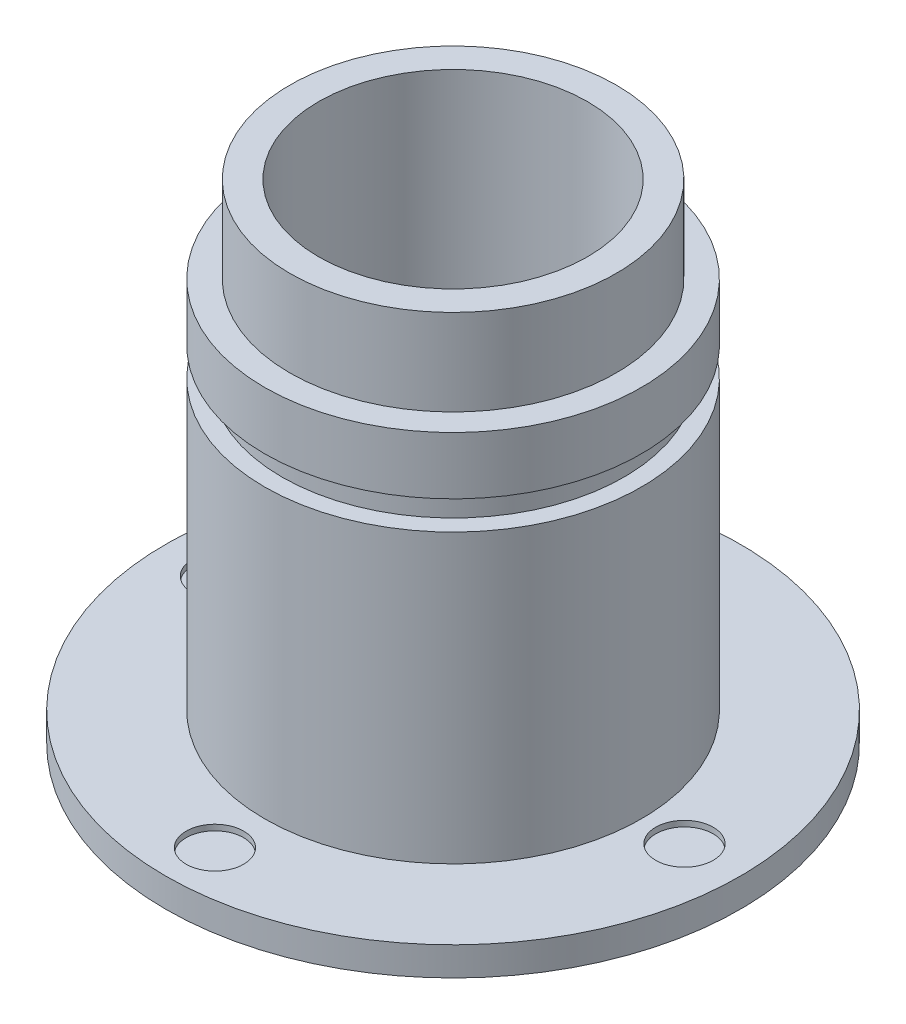
ISO-10303-21;
HEADER;
FILE_DESCRIPTION(('STEP AP214'),'2;1');
FILE_NAME('part.step','',(''),(''),'','','');
FILE_SCHEMA(('AUTOMOTIVE_DESIGN { 1 0 10303 214 1 1 1 1 }'));
ENDSEC;
DATA;
#1=APPLICATION_CONTEXT('core data for automotive mechanical design processes');
#2=APPLICATION_PROTOCOL_DEFINITION('international standard','automotive_design',2000,#1);
#3=PRODUCT_CONTEXT('',#1,'mechanical');
#4=PRODUCT('Part','Part','',(#3));
#5=PRODUCT_RELATED_PRODUCT_CATEGORY('part','',(#4));
#6=PRODUCT_DEFINITION_FORMATION('','',#4);
#7=PRODUCT_DEFINITION_CONTEXT('part definition',#1,'design');
#8=PRODUCT_DEFINITION('design','',#6,#7);
#9=PRODUCT_DEFINITION_SHAPE('','',#8);
#10=(LENGTH_UNIT() NAMED_UNIT(*) SI_UNIT(.MILLI.,.METRE.));
#11=(NAMED_UNIT(*) PLANE_ANGLE_UNIT() SI_UNIT($,.RADIAN.));
#12=(NAMED_UNIT(*) SI_UNIT($,.STERADIAN.) SOLID_ANGLE_UNIT());
#13=UNCERTAINTY_MEASURE_WITH_UNIT(LENGTH_MEASURE(1.E-05),#10,'distance_accuracy_value','');
#14=(GEOMETRIC_REPRESENTATION_CONTEXT(3) GLOBAL_UNCERTAINTY_ASSIGNED_CONTEXT((#13)) GLOBAL_UNIT_ASSIGNED_CONTEXT((#10,
#11,#12)) REPRESENTATION_CONTEXT('',''));
#15=CARTESIAN_POINT('',(0.,0.,0.));
#16=DIRECTION('',(0.,0.,1.));
#17=DIRECTION('',(1.,0.,0.));
#18=AXIS2_PLACEMENT_3D('',#15,#16,#17);
#19=CARTESIAN_POINT('',(0.,-77.6741071428572,0.));
#20=DIRECTION('',(0.,-1.,0.));
#21=DIRECTION('',(0.,0.,-1.));
#22=AXIS2_PLACEMENT_3D('',#19,#20,#21);
#23=PLANE('',#22);
#24=CARTESIAN_POINT('',(0.,-77.6741071428572,0.));
#25=DIRECTION('',(0.,1.,0.));
#26=DIRECTION('',(0.,0.,1.));
#27=AXIS2_PLACEMENT_3D('',#24,#25,#26);
#28=CIRCLE('',#27,127.);
#29=CARTESIAN_POINT('',(0.,-77.6741071428572,127.));
#30=VERTEX_POINT('',#29);
#31=EDGE_CURVE('E12',#30,#30,#28,.T.);
#32=ORIENTED_EDGE('',*,*,#31,.F.);
#33=EDGE_LOOP('',(#32));
#34=FACE_BOUND('',#33,.T.);
#35=ADVANCED_FACE('F34',(#34),#23,.T.);
#36=CARTESIAN_POINT('',(0.,71.3241071428572,0.));
#37=DIRECTION('',(0.,1.,0.));
#38=DIRECTION('',(0.,0.,1.));
#39=AXIS2_PLACEMENT_3D('',#36,#37,#38);
#40=CYLINDRICAL_SURFACE('',#39,127.);
#41=ORIENTED_EDGE('',*,*,#31,.T.);
#42=EDGE_LOOP('',(#41));
#43=FACE_BOUND('',#42,.T.);
#44=CARTESIAN_POINT('',(0.,-64.9741071428572,0.));
#45=DIRECTION('',(0.,1.,0.));
#46=DIRECTION('',(0.,0.,1.));
#47=AXIS2_PLACEMENT_3D('',#44,#45,#46);
#48=CIRCLE('',#47,127.);
#49=CARTESIAN_POINT('',(0.,-64.9741071428572,127.));
#50=VERTEX_POINT('',#49);
#51=EDGE_CURVE('E41',#50,#50,#48,.T.);
#52=ORIENTED_EDGE('',*,*,#51,.F.);
#53=EDGE_LOOP('',(#52));
#54=FACE_BOUND('',#53,.T.);
#55=ADVANCED_FACE('F103',(#43,#54),#40,.T.);
#56=CARTESIAN_POINT('',(-127.,-64.9741071428572,0.));
#57=DIRECTION('',(0.,1.,0.));
#58=DIRECTION('',(0.,0.,1.));
#59=AXIS2_PLACEMENT_3D('',#56,#57,#58);
#60=PLANE('',#59);
#61=CARTESIAN_POINT('',(-102.608331847626,-64.9741071428572,0.));
#62=DIRECTION('',(0.,1.,0.));
#63=DIRECTION('',(0.,0.,1.));
#64=AXIS2_PLACEMENT_3D('',#61,#62,#63);
#65=CIRCLE('',#64,12.7);
#66=CARTESIAN_POINT('',(-102.608331847626,-64.9741071428572,12.7));
#67=VERTEX_POINT('',#66);
#68=EDGE_CURVE('E37',#67,#67,#65,.T.);
#69=ORIENTED_EDGE('',*,*,#68,.F.);
#70=EDGE_LOOP('',(#69));
#71=FACE_BOUND('',#70,.T.);
#72=CARTESIAN_POINT('',(0.,-64.9741071428572,105.234824983657));
#73=DIRECTION('',(0.,1.,0.));
#74=DIRECTION('',(0.,0.,1.));
#75=AXIS2_PLACEMENT_3D('',#72,#73,#74);
#76=CIRCLE('',#75,12.7);
#77=CARTESIAN_POINT('',(0.,-64.9741071428572,117.934824983657));
#78=VERTEX_POINT('',#77);
#79=EDGE_CURVE('E56',#78,#78,#76,.T.);
#80=ORIENTED_EDGE('',*,*,#79,.F.);
#81=EDGE_LOOP('',(#80));
#82=FACE_BOUND('',#81,.T.);
#83=CARTESIAN_POINT('',(102.258132762822,-64.9741071428572,0.));
#84=DIRECTION('',(0.,1.,0.));
#85=DIRECTION('',(0.,0.,1.));
#86=AXIS2_PLACEMENT_3D('',#83,#84,#85);
#87=CIRCLE('',#86,12.7);
#88=CARTESIAN_POINT('',(102.258132762822,-64.9741071428572,12.7));
#89=VERTEX_POINT('',#88);
#90=EDGE_CURVE('E53',#89,#89,#87,.T.);
#91=ORIENTED_EDGE('',*,*,#90,.F.);
#92=EDGE_LOOP('',(#91));
#93=FACE_BOUND('',#92,.T.);
#94=CARTESIAN_POINT('',(0.,-64.9741071428572,-99.2814405419859));
#95=DIRECTION('',(0.,1.,0.));
#96=DIRECTION('',(0.,0.,1.));
#97=AXIS2_PLACEMENT_3D('',#94,#95,#96);
#98=CIRCLE('',#97,12.7);
#99=CARTESIAN_POINT('',(0.,-64.9741071428572,-86.5814405419859));
#100=VERTEX_POINT('',#99);
#101=EDGE_CURVE('E50',#100,#100,#98,.T.);
#102=ORIENTED_EDGE('',*,*,#101,.F.);
#103=EDGE_LOOP('',(#102));
#104=FACE_BOUND('',#103,.T.);
#105=ORIENTED_EDGE('',*,*,#51,.T.);
#106=EDGE_LOOP('',(#105));
#107=FACE_BOUND('',#106,.T.);
#108=CARTESIAN_POINT('',(0.,-64.9741071428572,0.));
#109=DIRECTION('',(0.,1.,0.));
#110=DIRECTION('',(0.,0.,1.));
#111=AXIS2_PLACEMENT_3D('',#108,#109,#110);
#112=CIRCLE('',#111,83.2303571428571);
#113=CARTESIAN_POINT('',(0.,-64.9741071428572,83.2303571428571));
#114=VERTEX_POINT('',#113);
#115=EDGE_CURVE('E46',#114,#114,#112,.T.);
#116=ORIENTED_EDGE('',*,*,#115,.F.);
#117=EDGE_LOOP('',(#116));
#118=FACE_BOUND('',#117,.T.);
#119=ADVANCED_FACE('F101',(#71,#82,#93,#104,#107,#118),#60,.T.);
#120=CARTESIAN_POINT('',(0.,71.3241071428572,0.));
#121=DIRECTION('',(0.,1.,0.));
#122=DIRECTION('',(0.,0.,1.));
#123=AXIS2_PLACEMENT_3D('',#120,#121,#122);
#124=CYLINDRICAL_SURFACE('',#123,83.2303571428571);
#125=ORIENTED_EDGE('',*,*,#115,.T.);
#126=EDGE_LOOP('',(#125));
#127=FACE_BOUND('',#126,.T.);
#128=CARTESIAN_POINT('',(0.,62.0258928571428,0.));
#129=DIRECTION('',(0.,1.,0.));
#130=DIRECTION('',(0.,0.,1.));
#131=AXIS2_PLACEMENT_3D('',#128,#129,#130);
#132=CIRCLE('',#131,83.2303571428571);
#133=CARTESIAN_POINT('',(0.,62.0258928571428,83.2303571428571));
#134=VERTEX_POINT('',#133);
#135=EDGE_CURVE('E93',#134,#134,#132,.T.);
#136=ORIENTED_EDGE('',*,*,#135,.F.);
#137=EDGE_LOOP('',(#136));
#138=FACE_BOUND('',#137,.T.);
#139=ADVANCED_FACE('F98',(#127,#138),#124,.T.);
#140=CARTESIAN_POINT('',(-83.2303571428571,62.0258928571428,0.));
#141=DIRECTION('',(0.,1.,0.));
#142=DIRECTION('',(0.,0.,1.));
#143=AXIS2_PLACEMENT_3D('',#140,#141,#142);
#144=PLANE('',#143);
#145=ORIENTED_EDGE('',*,*,#135,.T.);
#146=EDGE_LOOP('',(#145));
#147=FACE_BOUND('',#146,.T.);
#148=CARTESIAN_POINT('',(0.,62.0258928571428,0.));
#149=DIRECTION('',(0.,1.,0.));
#150=DIRECTION('',(0.,0.,1.));
#151=AXIS2_PLACEMENT_3D('',#148,#149,#150);
#152=CIRCLE('',#151,75.6103571428571);
#153=CARTESIAN_POINT('',(0.,62.0258928571428,75.6103571428571));
#154=VERTEX_POINT('',#153);
#155=EDGE_CURVE('E90',#154,#154,#152,.T.);
#156=ORIENTED_EDGE('',*,*,#155,.F.);
#157=EDGE_LOOP('',(#156));
#158=FACE_BOUND('',#157,.T.);
#159=ADVANCED_FACE('F110',(#147,#158),#144,.T.);
#160=CARTESIAN_POINT('',(0.,71.3241071428572,0.));
#161=DIRECTION('',(0.,1.,0.));
#162=DIRECTION('',(0.,0.,1.));
#163=AXIS2_PLACEMENT_3D('',#160,#161,#162);
#164=CYLINDRICAL_SURFACE('',#163,75.6103571428571);
#165=ORIENTED_EDGE('',*,*,#155,.T.);
#166=EDGE_LOOP('',(#165));
#167=FACE_BOUND('',#166,.T.);
#168=CARTESIAN_POINT('',(0.,74.7258928571428,0.));
#169=DIRECTION('',(0.,1.,0.));
#170=DIRECTION('',(0.,0.,1.));
#171=AXIS2_PLACEMENT_3D('',#168,#169,#170);
#172=CIRCLE('',#171,75.6103571428571);
#173=CARTESIAN_POINT('',(0.,74.7258928571428,75.6103571428571));
#174=VERTEX_POINT('',#173);
#175=EDGE_CURVE('E87',#174,#174,#172,.T.);
#176=ORIENTED_EDGE('',*,*,#175,.F.);
#177=EDGE_LOOP('',(#176));
#178=FACE_BOUND('',#177,.T.);
#179=ADVANCED_FACE('F138',(#167,#178),#164,.T.);
#180=CARTESIAN_POINT('',(-75.6103571428571,74.7258928571428,0.));
#181=DIRECTION('',(0.,-1.,0.));
#182=DIRECTION('',(0.,0.,-1.));
#183=AXIS2_PLACEMENT_3D('',#180,#181,#182);
#184=PLANE('',#183);
#185=ORIENTED_EDGE('',*,*,#175,.T.);
#186=EDGE_LOOP('',(#185));
#187=FACE_BOUND('',#186,.T.);
#188=CARTESIAN_POINT('',(0.,74.7258928571428,0.));
#189=DIRECTION('',(0.,1.,0.));
#190=DIRECTION('',(0.,0.,1.));
#191=AXIS2_PLACEMENT_3D('',#188,#189,#190);
#192=CIRCLE('',#191,83.2303571428571);
#193=CARTESIAN_POINT('',(0.,74.7258928571428,83.2303571428571));
#194=VERTEX_POINT('',#193);
#195=EDGE_CURVE('E84',#194,#194,#192,.T.);
#196=ORIENTED_EDGE('',*,*,#195,.F.);
#197=EDGE_LOOP('',(#196));
#198=FACE_BOUND('',#197,.T.);
#199=ADVANCED_FACE('F148',(#187,#198),#184,.T.);
#200=CARTESIAN_POINT('',(0.,71.3241071428572,0.));
#201=DIRECTION('',(0.,1.,0.));
#202=DIRECTION('',(0.,0.,1.));
#203=AXIS2_PLACEMENT_3D('',#200,#201,#202);
#204=CYLINDRICAL_SURFACE('',#203,83.2303571428571);
#205=ORIENTED_EDGE('',*,*,#195,.T.);
#206=EDGE_LOOP('',(#205));
#207=FACE_BOUND('',#206,.T.);
#208=CARTESIAN_POINT('',(0.,100.125892857143,0.));
#209=DIRECTION('',(0.,1.,0.));
#210=DIRECTION('',(0.,0.,1.));
#211=AXIS2_PLACEMENT_3D('',#208,#209,#210);
#212=CIRCLE('',#211,83.2303571428571);
#213=CARTESIAN_POINT('',(0.,100.125892857143,83.2303571428571));
#214=VERTEX_POINT('',#213);
#215=EDGE_CURVE('E81',#214,#214,#212,.T.);
#216=ORIENTED_EDGE('',*,*,#215,.F.);
#217=EDGE_LOOP('',(#216));
#218=FACE_BOUND('',#217,.T.);
#219=ADVANCED_FACE('F158',(#207,#218),#204,.T.);
#220=CARTESIAN_POINT('',(-83.2303571428571,100.125892857143,0.));
#221=DIRECTION('',(0.,1.,0.));
#222=DIRECTION('',(0.,0.,1.));
#223=AXIS2_PLACEMENT_3D('',#220,#221,#222);
#224=PLANE('',#223);
#225=ORIENTED_EDGE('',*,*,#215,.T.);
#226=EDGE_LOOP('',(#225));
#227=FACE_BOUND('',#226,.T.);
#228=CARTESIAN_POINT('',(0.,100.125892857143,0.));
#229=DIRECTION('',(0.,1.,0.));
#230=DIRECTION('',(0.,0.,1.));
#231=AXIS2_PLACEMENT_3D('',#228,#229,#230);
#232=CIRCLE('',#231,72.1178571428571);
#233=CARTESIAN_POINT('',(0.,100.125892857143,72.1178571428571));
#234=VERTEX_POINT('',#233);
#235=EDGE_CURVE('E78',#234,#234,#232,.T.);
#236=ORIENTED_EDGE('',*,*,#235,.F.);
#237=EDGE_LOOP('',(#236));
#238=FACE_BOUND('',#237,.T.);
#239=ADVANCED_FACE('F168',(#227,#238),#224,.T.);
#240=CARTESIAN_POINT('',(0.,71.3241071428572,0.));
#241=DIRECTION('',(0.,1.,0.));
#242=DIRECTION('',(0.,0.,1.));
#243=AXIS2_PLACEMENT_3D('',#240,#241,#242);
#244=CYLINDRICAL_SURFACE('',#243,72.1178571428571);
#245=ORIENTED_EDGE('',*,*,#235,.T.);
#246=EDGE_LOOP('',(#245));
#247=FACE_BOUND('',#246,.T.);
#248=CARTESIAN_POINT('',(0.,138.225892857143,0.));
#249=DIRECTION('',(0.,1.,0.));
#250=DIRECTION('',(0.,0.,1.));
#251=AXIS2_PLACEMENT_3D('',#248,#249,#250);
#252=CIRCLE('',#251,72.1178571428571);
#253=CARTESIAN_POINT('',(0.,138.225892857143,72.1178571428571));
#254=VERTEX_POINT('',#253);
#255=EDGE_CURVE('E70',#254,#254,#252,.T.);
#256=ORIENTED_EDGE('',*,*,#255,.F.);
#257=EDGE_LOOP('',(#256));
#258=FACE_BOUND('',#257,.T.);
#259=ADVANCED_FACE('F178',(#247,#258),#244,.T.);
#260=CARTESIAN_POINT('',(-72.1178571428571,138.225892857143,0.));
#261=DIRECTION('',(0.,1.,0.));
#262=DIRECTION('',(0.,0.,1.));
#263=AXIS2_PLACEMENT_3D('',#260,#261,#262);
#264=PLANE('',#263);
#265=ORIENTED_EDGE('',*,*,#255,.T.);
#266=EDGE_LOOP('',(#265));
#267=FACE_BOUND('',#266,.T.);
#268=CARTESIAN_POINT('',(0.,138.225892857143,0.));
#269=DIRECTION('',(0.,1.,0.));
#270=DIRECTION('',(0.,0.,1.));
#271=AXIS2_PLACEMENT_3D('',#268,#269,#270);
#272=CIRCLE('',#271,59.4178571428571);
#273=CARTESIAN_POINT('',(0.,138.225892857143,59.4178571428571));
#274=VERTEX_POINT('',#273);
#275=EDGE_CURVE('E65',#274,#274,#272,.T.);
#276=ORIENTED_EDGE('',*,*,#275,.F.);
#277=EDGE_LOOP('',(#276));
#278=FACE_BOUND('',#277,.T.);
#279=ADVANCED_FACE('F188',(#267,#278),#264,.T.);
#280=CARTESIAN_POINT('',(0.,71.3241071428572,0.));
#281=DIRECTION('',(0.,1.,0.));
#282=DIRECTION('',(0.,0.,1.));
#283=AXIS2_PLACEMENT_3D('',#280,#281,#282);
#284=CYLINDRICAL_SURFACE('',#283,59.4178571428571);
#285=ORIENTED_EDGE('',*,*,#275,.T.);
#286=EDGE_LOOP('',(#285));
#287=FACE_BOUND('',#286,.T.);
#288=CARTESIAN_POINT('',(0.,-64.9741071428572,0.));
#289=DIRECTION('',(0.,1.,0.));
#290=DIRECTION('',(0.,0.,1.));
#291=AXIS2_PLACEMENT_3D('',#288,#289,#290);
#292=CIRCLE('',#291,59.4178571428571);
#293=CARTESIAN_POINT('',(0.,-64.9741071428572,59.4178571428571));
#294=VERTEX_POINT('',#293);
#295=EDGE_CURVE('E61',#294,#294,#292,.T.);
#296=ORIENTED_EDGE('',*,*,#295,.F.);
#297=EDGE_LOOP('',(#296));
#298=FACE_BOUND('',#297,.T.);
#299=ADVANCED_FACE('F198',(#287,#298),#284,.F.);
#300=CARTESIAN_POINT('',(-59.4178571428571,-64.9741071428572,0.));
#301=DIRECTION('',(0.,1.,0.));
#302=DIRECTION('',(0.,0.,1.));
#303=AXIS2_PLACEMENT_3D('',#300,#301,#302);
#304=PLANE('',#303);
#305=ORIENTED_EDGE('',*,*,#295,.T.);
#306=EDGE_LOOP('',(#305));
#307=FACE_BOUND('',#306,.T.);
#308=ADVANCED_FACE('F208',(#307),#304,.T.);
#309=CARTESIAN_POINT('',(0.,-105.975131627134,-99.2814405419859));
#310=DIRECTION('',(0.,1.,0.));
#311=DIRECTION('',(0.,0.,1.));
#312=AXIS2_PLACEMENT_3D('',#309,#310,#311);
#313=CYLINDRICAL_SURFACE('',#312,12.7);
#314=CARTESIAN_POINT('',(0.,-67.5141071428572,-99.2814405419859));
#315=DIRECTION('',(0.,1.,0.));
#316=DIRECTION('',(0.,0.,1.));
#317=AXIS2_PLACEMENT_3D('',#314,#315,#316);
#318=CIRCLE('',#317,12.7);
#319=CARTESIAN_POINT('',(0.,-67.5141071428572,-86.5814405419859));
#320=VERTEX_POINT('',#319);
#321=EDGE_CURVE('E73',#320,#320,#318,.F.);
#322=CARTESIAN_POINT('',(0.,-64.9741071428572,-86.5814405419859));
#323=CARTESIAN_POINT('',(0.,-65.0005654761905,-86.5814405419859));
#324=CARTESIAN_POINT('',(0.,-65.0270238095238,-86.5814405419859));
#325=CARTESIAN_POINT('',(0.,-65.0799404761905,-86.5814405419859));
#326=CARTESIAN_POINT('',(0.,-65.1063988095238,-86.5814405419859));
#327=CARTESIAN_POINT('',(0.,-65.1593154761905,-86.5814405419859));
#328=CARTESIAN_POINT('',(0.,-65.1857738095238,-86.5814405419859));
#329=CARTESIAN_POINT('',(0.,-65.2386904761905,-86.5814405419859));
#330=CARTESIAN_POINT('',(0.,-65.2651488095238,-86.5814405419859));
#331=CARTESIAN_POINT('',(0.,-65.3180654761905,-86.5814405419859));
#332=CARTESIAN_POINT('',(0.,-65.3445238095238,-86.5814405419859));
#333=CARTESIAN_POINT('',(0.,-65.3974404761905,-86.5814405419859));
#334=CARTESIAN_POINT('',(0.,-65.4238988095238,-86.5814405419859));
#335=CARTESIAN_POINT('',(0.,-65.4768154761905,-86.5814405419859));
#336=CARTESIAN_POINT('',(0.,-65.5032738095238,-86.5814405419859));
#337=CARTESIAN_POINT('',(0.,-65.5561904761905,-86.5814405419859));
#338=CARTESIAN_POINT('',(0.,-65.5826488095238,-86.5814405419859));
#339=CARTESIAN_POINT('',(0.,-65.6355654761905,-86.5814405419859));
#340=CARTESIAN_POINT('',(0.,-65.6620238095238,-86.5814405419859));
#341=CARTESIAN_POINT('',(0.,-65.7149404761905,-86.5814405419859));
#342=CARTESIAN_POINT('',(0.,-65.7413988095238,-86.5814405419859));
#343=CARTESIAN_POINT('',(0.,-65.7943154761905,-86.5814405419859));
#344=CARTESIAN_POINT('',(0.,-65.8207738095238,-86.5814405419859));
#345=CARTESIAN_POINT('',(0.,-65.8736904761905,-86.5814405419859));
#346=CARTESIAN_POINT('',(0.,-65.9001488095238,-86.5814405419859));
#347=CARTESIAN_POINT('',(0.,-65.9530654761905,-86.5814405419859));
#348=CARTESIAN_POINT('',(0.,-65.9795238095238,-86.5814405419859));
#349=CARTESIAN_POINT('',(0.,-66.0324404761905,-86.5814405419859));
#350=CARTESIAN_POINT('',(0.,-66.0588988095238,-86.5814405419859));
#351=CARTESIAN_POINT('',(0.,-66.1118154761905,-86.5814405419859));
#352=CARTESIAN_POINT('',(0.,-66.1382738095238,-86.5814405419859));
#353=CARTESIAN_POINT('',(0.,-66.1911904761905,-86.5814405419859));
#354=CARTESIAN_POINT('',(0.,-66.2176488095238,-86.5814405419859));
#355=CARTESIAN_POINT('',(0.,-66.2705654761905,-86.5814405419859));
#356=CARTESIAN_POINT('',(0.,-66.2970238095238,-86.5814405419859));
#357=CARTESIAN_POINT('',(0.,-66.3499404761905,-86.5814405419859));
#358=CARTESIAN_POINT('',(0.,-66.3763988095238,-86.5814405419859));
#359=CARTESIAN_POINT('',(0.,-66.4293154761905,-86.5814405419859));
#360=CARTESIAN_POINT('',(0.,-66.4557738095238,-86.5814405419859));
#361=CARTESIAN_POINT('',(0.,-66.5086904761905,-86.5814405419859));
#362=CARTESIAN_POINT('',(0.,-66.5351488095238,-86.5814405419859));
#363=CARTESIAN_POINT('',(0.,-66.5880654761905,-86.5814405419859));
#364=CARTESIAN_POINT('',(0.,-66.6145238095238,-86.5814405419859));
#365=CARTESIAN_POINT('',(0.,-66.6674404761905,-86.5814405419859));
#366=CARTESIAN_POINT('',(0.,-66.6938988095238,-86.5814405419859));
#367=CARTESIAN_POINT('',(0.,-66.7468154761905,-86.5814405419859));
#368=CARTESIAN_POINT('',(0.,-66.7732738095238,-86.5814405419859));
#369=CARTESIAN_POINT('',(0.,-66.8261904761905,-86.5814405419859));
#370=CARTESIAN_POINT('',(0.,-66.8526488095238,-86.5814405419859));
#371=CARTESIAN_POINT('',(0.,-66.9055654761905,-86.5814405419859));
#372=CARTESIAN_POINT('',(0.,-66.9320238095238,-86.5814405419859));
#373=CARTESIAN_POINT('',(0.,-66.9849404761905,-86.5814405419859));
#374=CARTESIAN_POINT('',(0.,-67.0113988095238,-86.5814405419859));
#375=CARTESIAN_POINT('',(0.,-67.0643154761905,-86.5814405419859));
#376=CARTESIAN_POINT('',(0.,-67.0907738095238,-86.5814405419859));
#377=CARTESIAN_POINT('',(0.,-67.1436904761905,-86.5814405419859));
#378=CARTESIAN_POINT('',(0.,-67.1701488095238,-86.5814405419859));
#379=CARTESIAN_POINT('',(0.,-67.2230654761905,-86.5814405419859));
#380=CARTESIAN_POINT('',(0.,-67.2495238095238,-86.5814405419859));
#381=CARTESIAN_POINT('',(0.,-67.3024404761905,-86.5814405419859));
#382=CARTESIAN_POINT('',(0.,-67.3288988095238,-86.5814405419859));
#383=CARTESIAN_POINT('',(0.,-67.3818154761905,-86.5814405419859));
#384=CARTESIAN_POINT('',(0.,-67.4082738095238,-86.5814405419859));
#385=CARTESIAN_POINT('',(0.,-67.4611904761905,-86.5814405419859));
#386=CARTESIAN_POINT('',(0.,-67.4876488095238,-86.5814405419859));
#387=CARTESIAN_POINT('',(0.,-67.5141071428572,-86.5814405419859));
#388=B_SPLINE_CURVE_WITH_KNOTS('',3,(#322,#323,#324,#325,#326,#327,#328,#329,#330,#331,#332,
#333,#334,#335,#336,#337,#338,#339,#340,#341,#342,#343,#344,#345,#346,#347,#348,#349,#350,#351,
#352,#353,#354,#355,#356,#357,#358,#359,#360,#361,#362,#363,#364,#365,#366,#367,#368,#369,#370,
#371,#372,#373,#374,#375,#376,#377,#378,#379,#380,#381,#382,#383,#384,#385,#386,#387),
.UNSPECIFIED.,.F.,.F.,(4,2,2,2,2,2,2,2,2,2,2,2,2,2,2,2,2,2,2,2,2,2,2,2,2,2,2,2,2,2,2,2,4),(0.,
0.0793749999999926,0.158749999999985,0.238124999999992,0.317499999999998,0.396874999999991,
0.476249999999984,0.55562499999999,0.634999999999997,0.714374999999989,0.793749999999996,
0.873125000000002,0.952499999999995,1.03187499999999,1.11124999999999,1.190625,1.26999999999999,
1.34937499999999,1.42874999999999,1.508125,1.58749999999999,1.66687499999998,1.74624999999999,
1.825625,1.90499999999999,1.984375,2.06375,2.143125,2.22249999999999,2.301875,2.38125,
2.46062499999999,2.53999999999999),.UNSPECIFIED.);
#389=EDGE_CURVE('BSEAM217',#100,#320,#388,.T.);
#390=ORIENTED_EDGE('',*,*,#101,.T.);
#391=ORIENTED_EDGE('',*,*,#321,.T.);
#392=ORIENTED_EDGE('',*,*,#389,.T.);
#393=ORIENTED_EDGE('',*,*,#389,.F.);
#394=EDGE_LOOP('',(#390,#392,#391,#393));
#395=FACE_BOUND('',#394,.T.);
#396=ADVANCED_FACE('F217',(#395),#313,.F.);
#397=CARTESIAN_POINT('',(-127.,-67.5141071428572,0.));
#398=DIRECTION('',(0.,1.,0.));
#399=DIRECTION('',(0.,0.,1.));
#400=AXIS2_PLACEMENT_3D('',#397,#398,#399);
#401=PLANE('',#400);
#402=ORIENTED_EDGE('',*,*,#321,.F.);
#403=EDGE_LOOP('',(#402));
#404=FACE_BOUND('',#403,.T.);
#405=ADVANCED_FACE('F230',(#404),#401,.T.);
#406=CARTESIAN_POINT('',(102.258132762822,-105.975131627134,0.));
#407=DIRECTION('',(0.,1.,0.));
#408=DIRECTION('',(0.,0.,1.));
#409=AXIS2_PLACEMENT_3D('',#406,#407,#408);
#410=CYLINDRICAL_SURFACE('',#409,12.7);
#411=CARTESIAN_POINT('',(102.258132762822,-67.5141071428572,0.));
#412=DIRECTION('',(0.,1.,0.));
#413=DIRECTION('',(0.,0.,1.));
#414=AXIS2_PLACEMENT_3D('',#411,#412,#413);
#415=CIRCLE('',#414,12.7);
#416=CARTESIAN_POINT('',(102.258132762822,-67.5141071428572,12.7));
#417=VERTEX_POINT('',#416);
#418=EDGE_CURVE('E308',#417,#417,#415,.F.);
#419=CARTESIAN_POINT('',(102.258132762822,-64.9741071428572,12.7));
#420=CARTESIAN_POINT('',(102.258132762822,-65.0005654761905,12.7));
#421=CARTESIAN_POINT('',(102.258132762822,-65.0270238095238,12.7));
#422=CARTESIAN_POINT('',(102.258132762822,-65.0799404761905,12.7));
#423=CARTESIAN_POINT('',(102.258132762822,-65.1063988095238,12.7));
#424=CARTESIAN_POINT('',(102.258132762822,-65.1593154761905,12.7));
#425=CARTESIAN_POINT('',(102.258132762822,-65.1857738095238,12.7));
#426=CARTESIAN_POINT('',(102.258132762822,-65.2386904761905,12.7));
#427=CARTESIAN_POINT('',(102.258132762822,-65.2651488095238,12.7));
#428=CARTESIAN_POINT('',(102.258132762822,-65.3180654761905,12.7));
#429=CARTESIAN_POINT('',(102.258132762822,-65.3445238095238,12.7));
#430=CARTESIAN_POINT('',(102.258132762822,-65.3974404761905,12.7));
#431=CARTESIAN_POINT('',(102.258132762822,-65.4238988095238,12.7));
#432=CARTESIAN_POINT('',(102.258132762822,-65.4768154761905,12.7));
#433=CARTESIAN_POINT('',(102.258132762822,-65.5032738095238,12.7));
#434=CARTESIAN_POINT('',(102.258132762822,-65.5561904761905,12.7));
#435=CARTESIAN_POINT('',(102.258132762822,-65.5826488095238,12.7));
#436=CARTESIAN_POINT('',(102.258132762822,-65.6355654761905,12.7));
#437=CARTESIAN_POINT('',(102.258132762822,-65.6620238095238,12.7));
#438=CARTESIAN_POINT('',(102.258132762822,-65.7149404761905,12.7));
#439=CARTESIAN_POINT('',(102.258132762822,-65.7413988095238,12.7));
#440=CARTESIAN_POINT('',(102.258132762822,-65.7943154761905,12.7));
#441=CARTESIAN_POINT('',(102.258132762822,-65.8207738095238,12.7));
#442=CARTESIAN_POINT('',(102.258132762822,-65.8736904761905,12.7));
#443=CARTESIAN_POINT('',(102.258132762822,-65.9001488095238,12.7));
#444=CARTESIAN_POINT('',(102.258132762822,-65.9530654761905,12.7));
#445=CARTESIAN_POINT('',(102.258132762822,-65.9795238095238,12.7));
#446=CARTESIAN_POINT('',(102.258132762822,-66.0324404761905,12.7));
#447=CARTESIAN_POINT('',(102.258132762822,-66.0588988095238,12.7));
#448=CARTESIAN_POINT('',(102.258132762822,-66.1118154761905,12.7));
#449=CARTESIAN_POINT('',(102.258132762822,-66.1382738095238,12.7));
#450=CARTESIAN_POINT('',(102.258132762822,-66.1911904761905,12.7));
#451=CARTESIAN_POINT('',(102.258132762822,-66.2176488095238,12.7));
#452=CARTESIAN_POINT('',(102.258132762822,-66.2705654761905,12.7));
#453=CARTESIAN_POINT('',(102.258132762822,-66.2970238095238,12.7));
#454=CARTESIAN_POINT('',(102.258132762822,-66.3499404761905,12.7));
#455=CARTESIAN_POINT('',(102.258132762822,-66.3763988095238,12.7));
#456=CARTESIAN_POINT('',(102.258132762822,-66.4293154761905,12.7));
#457=CARTESIAN_POINT('',(102.258132762822,-66.4557738095238,12.7));
#458=CARTESIAN_POINT('',(102.258132762822,-66.5086904761905,12.7));
#459=CARTESIAN_POINT('',(102.258132762822,-66.5351488095238,12.7));
#460=CARTESIAN_POINT('',(102.258132762822,-66.5880654761905,12.7));
#461=CARTESIAN_POINT('',(102.258132762822,-66.6145238095238,12.7));
#462=CARTESIAN_POINT('',(102.258132762822,-66.6674404761905,12.7));
#463=CARTESIAN_POINT('',(102.258132762822,-66.6938988095238,12.7));
#464=CARTESIAN_POINT('',(102.258132762822,-66.7468154761905,12.7));
#465=CARTESIAN_POINT('',(102.258132762822,-66.7732738095238,12.7));
#466=CARTESIAN_POINT('',(102.258132762822,-66.8261904761905,12.7));
#467=CARTESIAN_POINT('',(102.258132762822,-66.8526488095238,12.7));
#468=CARTESIAN_POINT('',(102.258132762822,-66.9055654761905,12.7));
#469=CARTESIAN_POINT('',(102.258132762822,-66.9320238095238,12.7));
#470=CARTESIAN_POINT('',(102.258132762822,-66.9849404761905,12.7));
#471=CARTESIAN_POINT('',(102.258132762822,-67.0113988095238,12.7));
#472=CARTESIAN_POINT('',(102.258132762822,-67.0643154761905,12.7));
#473=CARTESIAN_POINT('',(102.258132762822,-67.0907738095238,12.7));
#474=CARTESIAN_POINT('',(102.258132762822,-67.1436904761905,12.7));
#475=CARTESIAN_POINT('',(102.258132762822,-67.1701488095238,12.7));
#476=CARTESIAN_POINT('',(102.258132762822,-67.2230654761905,12.7));
#477=CARTESIAN_POINT('',(102.258132762822,-67.2495238095238,12.7));
#478=CARTESIAN_POINT('',(102.258132762822,-67.3024404761905,12.7));
#479=CARTESIAN_POINT('',(102.258132762822,-67.3288988095238,12.7));
#480=CARTESIAN_POINT('',(102.258132762822,-67.3818154761905,12.7));
#481=CARTESIAN_POINT('',(102.258132762822,-67.4082738095238,12.7));
#482=CARTESIAN_POINT('',(102.258132762822,-67.4611904761905,12.7));
#483=CARTESIAN_POINT('',(102.258132762822,-67.4876488095238,12.7));
#484=CARTESIAN_POINT('',(102.258132762822,-67.5141071428572,12.7));
#485=B_SPLINE_CURVE_WITH_KNOTS('',3,(#419,#420,#421,#422,#423,#424,#425,#426,#427,#428,#429,
#430,#431,#432,#433,#434,#435,#436,#437,#438,#439,#440,#441,#442,#443,#444,#445,#446,#447,#448,
#449,#450,#451,#452,#453,#454,#455,#456,#457,#458,#459,#460,#461,#462,#463,#464,#465,#466,#467,
#468,#469,#470,#471,#472,#473,#474,#475,#476,#477,#478,#479,#480,#481,#482,#483,#484),
.UNSPECIFIED.,.F.,.F.,(4,2,2,2,2,2,2,2,2,2,2,2,2,2,2,2,2,2,2,2,2,2,2,2,2,2,2,2,2,2,2,2,4),(0.,
0.0793749999999926,0.158749999999985,0.238124999999992,0.317499999999998,0.396874999999991,
0.476249999999984,0.55562499999999,0.634999999999997,0.714374999999989,0.793749999999996,
0.873125000000002,0.952499999999995,1.03187499999999,1.11124999999999,1.190625,1.26999999999999,
1.34937499999999,1.42874999999999,1.508125,1.58749999999999,1.66687499999998,1.74624999999999,
1.825625,1.90499999999999,1.984375,2.06375,2.143125,2.22249999999999,2.301875,2.38125,
2.46062499999999,2.53999999999999),.UNSPECIFIED.);
#486=EDGE_CURVE('BSEAM240',#89,#417,#485,.T.);
#487=ORIENTED_EDGE('',*,*,#90,.T.);
#488=ORIENTED_EDGE('',*,*,#418,.T.);
#489=ORIENTED_EDGE('',*,*,#486,.T.);
#490=ORIENTED_EDGE('',*,*,#486,.F.);
#491=EDGE_LOOP('',(#487,#489,#488,#490));
#492=FACE_BOUND('',#491,.T.);
#493=ADVANCED_FACE('F240',(#492),#410,.F.);
#494=CARTESIAN_POINT('',(-127.,-67.5141071428572,0.));
#495=DIRECTION('',(0.,1.,0.));
#496=DIRECTION('',(0.,0.,1.));
#497=AXIS2_PLACEMENT_3D('',#494,#495,#496);
#498=PLANE('',#497);
#499=ORIENTED_EDGE('',*,*,#418,.F.);
#500=EDGE_LOOP('',(#499));
#501=FACE_BOUND('',#500,.T.);
#502=ADVANCED_FACE('F250',(#501),#498,.T.);
#503=CARTESIAN_POINT('',(0.,-105.975131627134,105.234824983657));
#504=DIRECTION('',(0.,1.,0.));
#505=DIRECTION('',(0.,0.,1.));
#506=AXIS2_PLACEMENT_3D('',#503,#504,#505);
#507=CYLINDRICAL_SURFACE('',#506,12.7);
#508=CARTESIAN_POINT('',(0.,-67.5141071428572,105.234824983657));
#509=DIRECTION('',(0.,1.,0.));
#510=DIRECTION('',(0.,0.,1.));
#511=AXIS2_PLACEMENT_3D('',#508,#509,#510);
#512=CIRCLE('',#511,12.7);
#513=CARTESIAN_POINT('',(0.,-67.5141071428572,117.934824983657));
#514=VERTEX_POINT('',#513);
#515=EDGE_CURVE('E305',#514,#514,#512,.F.);
#516=CARTESIAN_POINT('',(0.,-64.9741071428572,117.934824983657));
#517=CARTESIAN_POINT('',(0.,-65.0005654761905,117.934824983657));
#518=CARTESIAN_POINT('',(0.,-65.0270238095238,117.934824983657));
#519=CARTESIAN_POINT('',(0.,-65.0799404761905,117.934824983657));
#520=CARTESIAN_POINT('',(0.,-65.1063988095238,117.934824983657));
#521=CARTESIAN_POINT('',(0.,-65.1593154761905,117.934824983657));
#522=CARTESIAN_POINT('',(0.,-65.1857738095238,117.934824983657));
#523=CARTESIAN_POINT('',(0.,-65.2386904761905,117.934824983657));
#524=CARTESIAN_POINT('',(0.,-65.2651488095238,117.934824983657));
#525=CARTESIAN_POINT('',(0.,-65.3180654761905,117.934824983657));
#526=CARTESIAN_POINT('',(0.,-65.3445238095238,117.934824983657));
#527=CARTESIAN_POINT('',(0.,-65.3974404761905,117.934824983657));
#528=CARTESIAN_POINT('',(0.,-65.4238988095238,117.934824983657));
#529=CARTESIAN_POINT('',(0.,-65.4768154761905,117.934824983657));
#530=CARTESIAN_POINT('',(0.,-65.5032738095238,117.934824983657));
#531=CARTESIAN_POINT('',(0.,-65.5561904761905,117.934824983657));
#532=CARTESIAN_POINT('',(0.,-65.5826488095238,117.934824983657));
#533=CARTESIAN_POINT('',(0.,-65.6355654761905,117.934824983657));
#534=CARTESIAN_POINT('',(0.,-65.6620238095238,117.934824983657));
#535=CARTESIAN_POINT('',(0.,-65.7149404761905,117.934824983657));
#536=CARTESIAN_POINT('',(0.,-65.7413988095238,117.934824983657));
#537=CARTESIAN_POINT('',(0.,-65.7943154761905,117.934824983657));
#538=CARTESIAN_POINT('',(0.,-65.8207738095238,117.934824983657));
#539=CARTESIAN_POINT('',(0.,-65.8736904761905,117.934824983657));
#540=CARTESIAN_POINT('',(0.,-65.9001488095238,117.934824983657));
#541=CARTESIAN_POINT('',(0.,-65.9530654761905,117.934824983657));
#542=CARTESIAN_POINT('',(0.,-65.9795238095238,117.934824983657));
#543=CARTESIAN_POINT('',(0.,-66.0324404761905,117.934824983657));
#544=CARTESIAN_POINT('',(0.,-66.0588988095238,117.934824983657));
#545=CARTESIAN_POINT('',(0.,-66.1118154761905,117.934824983657));
#546=CARTESIAN_POINT('',(0.,-66.1382738095238,117.934824983657));
#547=CARTESIAN_POINT('',(0.,-66.1911904761905,117.934824983657));
#548=CARTESIAN_POINT('',(0.,-66.2176488095238,117.934824983657));
#549=CARTESIAN_POINT('',(0.,-66.2705654761905,117.934824983657));
#550=CARTESIAN_POINT('',(0.,-66.2970238095238,117.934824983657));
#551=CARTESIAN_POINT('',(0.,-66.3499404761905,117.934824983657));
#552=CARTESIAN_POINT('',(0.,-66.3763988095238,117.934824983657));
#553=CARTESIAN_POINT('',(0.,-66.4293154761905,117.934824983657));
#554=CARTESIAN_POINT('',(0.,-66.4557738095238,117.934824983657));
#555=CARTESIAN_POINT('',(0.,-66.5086904761905,117.934824983657));
#556=CARTESIAN_POINT('',(0.,-66.5351488095238,117.934824983657));
#557=CARTESIAN_POINT('',(0.,-66.5880654761905,117.934824983657));
#558=CARTESIAN_POINT('',(0.,-66.6145238095238,117.934824983657));
#559=CARTESIAN_POINT('',(0.,-66.6674404761905,117.934824983657));
#560=CARTESIAN_POINT('',(0.,-66.6938988095238,117.934824983657));
#561=CARTESIAN_POINT('',(0.,-66.7468154761905,117.934824983657));
#562=CARTESIAN_POINT('',(0.,-66.7732738095238,117.934824983657));
#563=CARTESIAN_POINT('',(0.,-66.8261904761905,117.934824983657));
#564=CARTESIAN_POINT('',(0.,-66.8526488095238,117.934824983657));
#565=CARTESIAN_POINT('',(0.,-66.9055654761905,117.934824983657));
#566=CARTESIAN_POINT('',(0.,-66.9320238095238,117.934824983657));
#567=CARTESIAN_POINT('',(0.,-66.9849404761905,117.934824983657));
#568=CARTESIAN_POINT('',(0.,-67.0113988095238,117.934824983657));
#569=CARTESIAN_POINT('',(0.,-67.0643154761905,117.934824983657));
#570=CARTESIAN_POINT('',(0.,-67.0907738095238,117.934824983657));
#571=CARTESIAN_POINT('',(0.,-67.1436904761905,117.934824983657));
#572=CARTESIAN_POINT('',(0.,-67.1701488095238,117.934824983657));
#573=CARTESIAN_POINT('',(0.,-67.2230654761905,117.934824983657));
#574=CARTESIAN_POINT('',(0.,-67.2495238095238,117.934824983657));
#575=CARTESIAN_POINT('',(0.,-67.3024404761905,117.934824983657));
#576=CARTESIAN_POINT('',(0.,-67.3288988095238,117.934824983657));
#577=CARTESIAN_POINT('',(0.,-67.3818154761905,117.934824983657));
#578=CARTESIAN_POINT('',(0.,-67.4082738095238,117.934824983657));
#579=CARTESIAN_POINT('',(0.,-67.4611904761905,117.934824983657));
#580=CARTESIAN_POINT('',(0.,-67.4876488095238,117.934824983657));
#581=CARTESIAN_POINT('',(0.,-67.5141071428572,117.934824983657));
#582=B_SPLINE_CURVE_WITH_KNOTS('',3,(#516,#517,#518,#519,#520,#521,#522,#523,#524,#525,#526,
#527,#528,#529,#530,#531,#532,#533,#534,#535,#536,#537,#538,#539,#540,#541,#542,#543,#544,#545,
#546,#547,#548,#549,#550,#551,#552,#553,#554,#555,#556,#557,#558,#559,#560,#561,#562,#563,#564,
#565,#566,#567,#568,#569,#570,#571,#572,#573,#574,#575,#576,#577,#578,#579,#580,#581),
.UNSPECIFIED.,.F.,.F.,(4,2,2,2,2,2,2,2,2,2,2,2,2,2,2,2,2,2,2,2,2,2,2,2,2,2,2,2,2,2,2,2,4),(0.,
0.0793749999999926,0.158749999999985,0.238124999999992,0.317499999999998,0.396874999999991,
0.476249999999984,0.55562499999999,0.634999999999997,0.714374999999989,0.793749999999996,
0.873125000000002,0.952499999999995,1.03187499999999,1.11124999999999,1.190625,1.26999999999999,
1.34937499999999,1.42874999999999,1.508125,1.58749999999999,1.66687499999998,1.74624999999999,
1.825625,1.90499999999999,1.984375,2.06375,2.143125,2.22249999999999,2.301875,2.38125,
2.46062499999999,2.53999999999999),.UNSPECIFIED.);
#583=EDGE_CURVE('BSEAM260',#78,#514,#582,.T.);
#584=ORIENTED_EDGE('',*,*,#79,.T.);
#585=ORIENTED_EDGE('',*,*,#515,.T.);
#586=ORIENTED_EDGE('',*,*,#583,.T.);
#587=ORIENTED_EDGE('',*,*,#583,.F.);
#588=EDGE_LOOP('',(#584,#586,#585,#587));
#589=FACE_BOUND('',#588,.T.);
#590=ADVANCED_FACE('F260',(#589),#507,.F.);
#591=CARTESIAN_POINT('',(-127.,-67.5141071428572,0.));
#592=DIRECTION('',(0.,1.,0.));
#593=DIRECTION('',(0.,0.,1.));
#594=AXIS2_PLACEMENT_3D('',#591,#592,#593);
#595=PLANE('',#594);
#596=ORIENTED_EDGE('',*,*,#515,.F.);
#597=EDGE_LOOP('',(#596));
#598=FACE_BOUND('',#597,.T.);
#599=ADVANCED_FACE('F270',(#598),#595,.T.);
#600=CARTESIAN_POINT('',(-102.608331847626,-105.975131627134,0.));
#601=DIRECTION('',(0.,1.,0.));
#602=DIRECTION('',(0.,0.,1.));
#603=AXIS2_PLACEMENT_3D('',#600,#601,#602);
#604=CYLINDRICAL_SURFACE('',#603,12.7);
#605=CARTESIAN_POINT('',(-102.608331847626,-67.5141071428572,0.));
#606=DIRECTION('',(0.,1.,0.));
#607=DIRECTION('',(0.,0.,1.));
#608=AXIS2_PLACEMENT_3D('',#605,#606,#607);
#609=CIRCLE('',#608,12.7);
#610=CARTESIAN_POINT('',(-102.608331847626,-67.5141071428572,12.7));
#611=VERTEX_POINT('',#610);
#612=EDGE_CURVE('E54',#611,#611,#609,.F.);
#613=CARTESIAN_POINT('',(-102.608331847626,-64.9741071428572,12.7));
#614=CARTESIAN_POINT('',(-102.608331847626,-65.0005654761905,12.7));
#615=CARTESIAN_POINT('',(-102.608331847626,-65.0270238095238,12.7));
#616=CARTESIAN_POINT('',(-102.608331847626,-65.0799404761905,12.7));
#617=CARTESIAN_POINT('',(-102.608331847626,-65.1063988095238,12.7));
#618=CARTESIAN_POINT('',(-102.608331847626,-65.1593154761905,12.7));
#619=CARTESIAN_POINT('',(-102.608331847626,-65.1857738095238,12.7));
#620=CARTESIAN_POINT('',(-102.608331847626,-65.2386904761905,12.7));
#621=CARTESIAN_POINT('',(-102.608331847626,-65.2651488095238,12.7));
#622=CARTESIAN_POINT('',(-102.608331847626,-65.3180654761905,12.7));
#623=CARTESIAN_POINT('',(-102.608331847626,-65.3445238095238,12.7));
#624=CARTESIAN_POINT('',(-102.608331847626,-65.3974404761905,12.7));
#625=CARTESIAN_POINT('',(-102.608331847626,-65.4238988095238,12.7));
#626=CARTESIAN_POINT('',(-102.608331847626,-65.4768154761905,12.7));
#627=CARTESIAN_POINT('',(-102.608331847626,-65.5032738095238,12.7));
#628=CARTESIAN_POINT('',(-102.608331847626,-65.5561904761905,12.7));
#629=CARTESIAN_POINT('',(-102.608331847626,-65.5826488095238,12.7));
#630=CARTESIAN_POINT('',(-102.608331847626,-65.6355654761905,12.7));
#631=CARTESIAN_POINT('',(-102.608331847626,-65.6620238095238,12.7));
#632=CARTESIAN_POINT('',(-102.608331847626,-65.7149404761905,12.7));
#633=CARTESIAN_POINT('',(-102.608331847626,-65.7413988095238,12.7));
#634=CARTESIAN_POINT('',(-102.608331847626,-65.7943154761905,12.7));
#635=CARTESIAN_POINT('',(-102.608331847626,-65.8207738095238,12.7));
#636=CARTESIAN_POINT('',(-102.608331847626,-65.8736904761905,12.7));
#637=CARTESIAN_POINT('',(-102.608331847626,-65.9001488095238,12.7));
#638=CARTESIAN_POINT('',(-102.608331847626,-65.9530654761905,12.7));
#639=CARTESIAN_POINT('',(-102.608331847626,-65.9795238095238,12.7));
#640=CARTESIAN_POINT('',(-102.608331847626,-66.0324404761905,12.7));
#641=CARTESIAN_POINT('',(-102.608331847626,-66.0588988095238,12.7));
#642=CARTESIAN_POINT('',(-102.608331847626,-66.1118154761905,12.7));
#643=CARTESIAN_POINT('',(-102.608331847626,-66.1382738095238,12.7));
#644=CARTESIAN_POINT('',(-102.608331847626,-66.1911904761905,12.7));
#645=CARTESIAN_POINT('',(-102.608331847626,-66.2176488095238,12.7));
#646=CARTESIAN_POINT('',(-102.608331847626,-66.2705654761905,12.7));
#647=CARTESIAN_POINT('',(-102.608331847626,-66.2970238095238,12.7));
#648=CARTESIAN_POINT('',(-102.608331847626,-66.3499404761905,12.7));
#649=CARTESIAN_POINT('',(-102.608331847626,-66.3763988095238,12.7));
#650=CARTESIAN_POINT('',(-102.608331847626,-66.4293154761905,12.7));
#651=CARTESIAN_POINT('',(-102.608331847626,-66.4557738095238,12.7));
#652=CARTESIAN_POINT('',(-102.608331847626,-66.5086904761905,12.7));
#653=CARTESIAN_POINT('',(-102.608331847626,-66.5351488095238,12.7));
#654=CARTESIAN_POINT('',(-102.608331847626,-66.5880654761905,12.7));
#655=CARTESIAN_POINT('',(-102.608331847626,-66.6145238095238,12.7));
#656=CARTESIAN_POINT('',(-102.608331847626,-66.6674404761905,12.7));
#657=CARTESIAN_POINT('',(-102.608331847626,-66.6938988095238,12.7));
#658=CARTESIAN_POINT('',(-102.608331847626,-66.7468154761905,12.7));
#659=CARTESIAN_POINT('',(-102.608331847626,-66.7732738095238,12.7));
#660=CARTESIAN_POINT('',(-102.608331847626,-66.8261904761905,12.7));
#661=CARTESIAN_POINT('',(-102.608331847626,-66.8526488095238,12.7));
#662=CARTESIAN_POINT('',(-102.608331847626,-66.9055654761905,12.7));
#663=CARTESIAN_POINT('',(-102.608331847626,-66.9320238095238,12.7));
#664=CARTESIAN_POINT('',(-102.608331847626,-66.9849404761905,12.7));
#665=CARTESIAN_POINT('',(-102.608331847626,-67.0113988095238,12.7));
#666=CARTESIAN_POINT('',(-102.608331847626,-67.0643154761905,12.7));
#667=CARTESIAN_POINT('',(-102.608331847626,-67.0907738095238,12.7));
#668=CARTESIAN_POINT('',(-102.608331847626,-67.1436904761905,12.7));
#669=CARTESIAN_POINT('',(-102.608331847626,-67.1701488095238,12.7));
#670=CARTESIAN_POINT('',(-102.608331847626,-67.2230654761905,12.7));
#671=CARTESIAN_POINT('',(-102.608331847626,-67.2495238095238,12.7));
#672=CARTESIAN_POINT('',(-102.608331847626,-67.3024404761905,12.7));
#673=CARTESIAN_POINT('',(-102.608331847626,-67.3288988095238,12.7));
#674=CARTESIAN_POINT('',(-102.608331847626,-67.3818154761905,12.7));
#675=CARTESIAN_POINT('',(-102.608331847626,-67.4082738095238,12.7));
#676=CARTESIAN_POINT('',(-102.608331847626,-67.4611904761905,12.7));
#677=CARTESIAN_POINT('',(-102.608331847626,-67.4876488095238,12.7));
#678=CARTESIAN_POINT('',(-102.608331847626,-67.5141071428572,12.7));
#679=B_SPLINE_CURVE_WITH_KNOTS('',3,(#613,#614,#615,#616,#617,#618,#619,#620,#621,#622,#623,
#624,#625,#626,#627,#628,#629,#630,#631,#632,#633,#634,#635,#636,#637,#638,#639,#640,#641,#642,
#643,#644,#645,#646,#647,#648,#649,#650,#651,#652,#653,#654,#655,#656,#657,#658,#659,#660,#661,
#662,#663,#664,#665,#666,#667,#668,#669,#670,#671,#672,#673,#674,#675,#676,#677,#678),
.UNSPECIFIED.,.F.,.F.,(4,2,2,2,2,2,2,2,2,2,2,2,2,2,2,2,2,2,2,2,2,2,2,2,2,2,2,2,2,2,2,2,4),(0.,
0.0793749999999926,0.158749999999985,0.238124999999992,0.317499999999998,0.396874999999991,
0.476249999999984,0.55562499999999,0.634999999999997,0.714374999999989,0.793749999999996,
0.873125000000002,0.952499999999995,1.03187499999999,1.11124999999999,1.190625,1.26999999999999,
1.34937499999999,1.42874999999999,1.508125,1.58749999999999,1.66687499999998,1.74624999999999,
1.825625,1.90499999999999,1.984375,2.06375,2.143125,2.22249999999999,2.301875,2.38125,
2.46062499999999,2.53999999999999),.UNSPECIFIED.);
#680=EDGE_CURVE('BSEAM279',#67,#611,#679,.T.);
#681=ORIENTED_EDGE('',*,*,#68,.T.);
#682=ORIENTED_EDGE('',*,*,#612,.T.);
#683=ORIENTED_EDGE('',*,*,#680,.T.);
#684=ORIENTED_EDGE('',*,*,#680,.F.);
#685=EDGE_LOOP('',(#681,#683,#682,#684));
#686=FACE_BOUND('',#685,.T.);
#687=ADVANCED_FACE('F279',(#686),#604,.F.);
#688=CARTESIAN_POINT('',(-127.,-67.5141071428572,0.));
#689=DIRECTION('',(0.,1.,0.));
#690=DIRECTION('',(0.,0.,1.));
#691=AXIS2_PLACEMENT_3D('',#688,#689,#690);
#692=PLANE('',#691);
#693=ORIENTED_EDGE('',*,*,#612,.F.);
#694=EDGE_LOOP('',(#693));
#695=FACE_BOUND('',#694,.T.);
#696=ADVANCED_FACE('F289',(#695),#692,.T.);
#697=CLOSED_SHELL('',(#35,#55,#119,#139,#159,#179,#199,#219,#239,#259,#279,#299,#308,#396,#405,
#493,#502,#590,#599,#687,#696));
#698=MANIFOLD_SOLID_BREP('B2',#697);
#699=ADVANCED_BREP_SHAPE_REPRESENTATION('',(#18,#698),#14);
#700=SHAPE_DEFINITION_REPRESENTATION(#9,#699);
ENDSEC;
END-ISO-10303-21;
